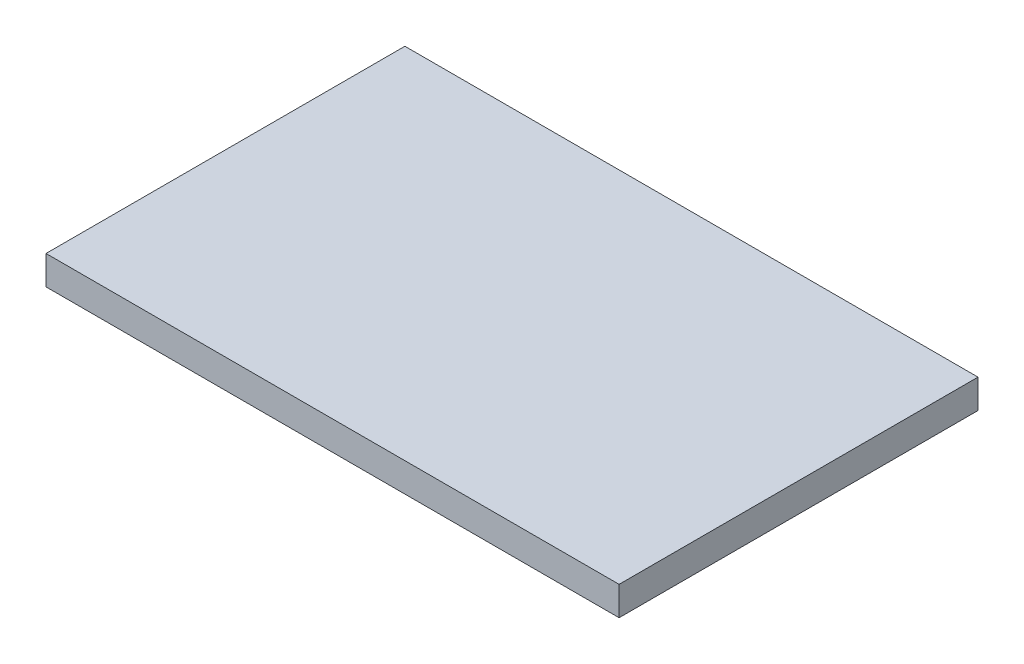
ISO-10303-21;
HEADER;
FILE_DESCRIPTION(('STEP AP214'),'2;1');
FILE_NAME('part.step','',(''),(''),'','','');
FILE_SCHEMA(('AUTOMOTIVE_DESIGN { 1 0 10303 214 1 1 1 1 }'));
ENDSEC;
DATA;
#1=APPLICATION_CONTEXT('core data for automotive mechanical design processes');
#2=APPLICATION_PROTOCOL_DEFINITION('international standard','automotive_design',2000,#1);
#3=PRODUCT_CONTEXT('',#1,'mechanical');
#4=PRODUCT('Part','Part','',(#3));
#5=PRODUCT_RELATED_PRODUCT_CATEGORY('part','',(#4));
#6=PRODUCT_DEFINITION_FORMATION('','',#4);
#7=PRODUCT_DEFINITION_CONTEXT('part definition',#1,'design');
#8=PRODUCT_DEFINITION('design','',#6,#7);
#9=PRODUCT_DEFINITION_SHAPE('','',#8);
#10=(LENGTH_UNIT() NAMED_UNIT(*) SI_UNIT(.MILLI.,.METRE.));
#11=(NAMED_UNIT(*) PLANE_ANGLE_UNIT() SI_UNIT($,.RADIAN.));
#12=(NAMED_UNIT(*) SI_UNIT($,.STERADIAN.) SOLID_ANGLE_UNIT());
#13=UNCERTAINTY_MEASURE_WITH_UNIT(LENGTH_MEASURE(1.E-05),#10,'distance_accuracy_value','');
#14=(GEOMETRIC_REPRESENTATION_CONTEXT(3) GLOBAL_UNCERTAINTY_ASSIGNED_CONTEXT((#13)) GLOBAL_UNIT_ASSIGNED_CONTEXT((#10,
#11,#12)) REPRESENTATION_CONTEXT('',''));
#15=CARTESIAN_POINT('',(0.,0.,0.));
#16=DIRECTION('',(0.,0.,1.));
#17=DIRECTION('',(1.,0.,0.));
#18=AXIS2_PLACEMENT_3D('',#15,#16,#17);
#19=CARTESIAN_POINT('',(-66.2042634425708,25.,32.0636334712058));
#20=DIRECTION('',(0.,0.,-1.));
#21=DIRECTION('',(-1.,0.,0.));
#22=AXIS2_PLACEMENT_3D('',#19,#20,#21);
#23=PLANE('',#22);
#24=DIRECTION('',(1.,0.,0.));
#25=VECTOR('',#24,1.);
#26=CARTESIAN_POINT('',(-66.2042634425708,0.,32.0636334712058));
#27=LINE('',#26,#25);
#28=CARTESIAN_POINT('',(-66.2042634425708,0.,32.0636334712058));
#29=VERTEX_POINT('',#28);
#30=CARTESIAN_POINT('',(428.795736557429,0.,32.0636334712058));
#31=VERTEX_POINT('',#30);
#32=EDGE_CURVE('E97',#29,#31,#27,.T.);
#33=ORIENTED_EDGE('',*,*,#32,.T.);
#34=DIRECTION('',(0.,-1.,0.));
#35=VECTOR('',#34,1.);
#36=CARTESIAN_POINT('',(428.795736557429,25.,32.0636334712058));
#37=LINE('',#36,#35);
#38=CARTESIAN_POINT('',(428.795736557429,25.,32.0636334712058));
#39=VERTEX_POINT('',#38);
#40=EDGE_CURVE('E11',#39,#31,#37,.T.);
#41=ORIENTED_EDGE('',*,*,#40,.F.);
#42=DIRECTION('',(1.,0.,0.));
#43=VECTOR('',#42,1.);
#44=CARTESIAN_POINT('',(-66.2042634425708,25.,32.0636334712058));
#45=LINE('',#44,#43);
#46=CARTESIAN_POINT('',(-66.2042634425708,25.,32.0636334712058));
#47=VERTEX_POINT('',#46);
#48=EDGE_CURVE('E74',#47,#39,#45,.T.);
#49=ORIENTED_EDGE('',*,*,#48,.F.);
#50=DIRECTION('',(0.,-1.,0.));
#51=VECTOR('',#50,1.);
#52=CARTESIAN_POINT('',(-66.2042634425708,25.,32.0636334712058));
#53=LINE('',#52,#51);
#54=EDGE_CURVE('E93',#47,#29,#53,.T.);
#55=ORIENTED_EDGE('',*,*,#54,.T.);
#56=EDGE_LOOP('',(#33,#41,#49,#55));
#57=FACE_BOUND('',#56,.T.);
#58=ADVANCED_FACE('F35',(#57),#23,.F.);
#59=CARTESIAN_POINT('',(428.795736557429,25.,-277.936366528794));
#60=DIRECTION('',(1.,0.,0.));
#61=DIRECTION('',(0.,0.,-1.));
#62=AXIS2_PLACEMENT_3D('',#59,#60,#61);
#63=PLANE('',#62);
#64=DIRECTION('',(0.,0.,1.));
#65=VECTOR('',#64,1.);
#66=CARTESIAN_POINT('',(428.795736557429,0.,-277.936366528794));
#67=LINE('',#66,#65);
#68=CARTESIAN_POINT('',(428.795736557429,0.,-277.936366528794));
#69=VERTEX_POINT('',#68);
#70=EDGE_CURVE('E83',#69,#31,#67,.T.);
#71=ORIENTED_EDGE('',*,*,#70,.F.);
#72=DIRECTION('',(0.,-1.,0.));
#73=VECTOR('',#72,1.);
#74=CARTESIAN_POINT('',(428.795736557429,25.,-277.936366528794));
#75=LINE('',#74,#73);
#76=CARTESIAN_POINT('',(428.795736557429,25.,-277.936366528794));
#77=VERTEX_POINT('',#76);
#78=EDGE_CURVE('E43',#77,#69,#75,.T.);
#79=ORIENTED_EDGE('',*,*,#78,.F.);
#80=DIRECTION('',(0.,0.,1.));
#81=VECTOR('',#80,1.);
#82=CARTESIAN_POINT('',(428.795736557429,25.,-277.936366528794));
#83=LINE('',#82,#81);
#84=EDGE_CURVE('E81',#77,#39,#83,.T.);
#85=ORIENTED_EDGE('',*,*,#84,.T.);
#86=ORIENTED_EDGE('',*,*,#40,.T.);
#87=EDGE_LOOP('',(#71,#79,#85,#86));
#88=FACE_BOUND('',#87,.T.);
#89=ADVANCED_FACE('F80',(#88),#63,.T.);
#90=CARTESIAN_POINT('',(-66.2042634425708,25.,-277.936366528794));
#91=DIRECTION('',(0.,0.,-1.));
#92=DIRECTION('',(-1.,0.,0.));
#93=AXIS2_PLACEMENT_3D('',#90,#91,#92);
#94=PLANE('',#93);
#95=DIRECTION('',(1.,0.,0.));
#96=VECTOR('',#95,1.);
#97=CARTESIAN_POINT('',(-66.2042634425708,0.,-277.936366528794));
#98=LINE('',#97,#96);
#99=CARTESIAN_POINT('',(-66.2042634425708,0.,-277.936366528794));
#100=VERTEX_POINT('',#99);
#101=EDGE_CURVE('E101',#100,#69,#98,.T.);
#102=ORIENTED_EDGE('',*,*,#101,.F.);
#103=DIRECTION('',(0.,-1.,0.));
#104=VECTOR('',#103,1.);
#105=CARTESIAN_POINT('',(-66.2042634425708,25.,-277.936366528794));
#106=LINE('',#105,#104);
#107=CARTESIAN_POINT('',(-66.2042634425708,25.,-277.936366528794));
#108=VERTEX_POINT('',#107);
#109=EDGE_CURVE('E66',#108,#100,#106,.T.);
#110=ORIENTED_EDGE('',*,*,#109,.F.);
#111=DIRECTION('',(1.,0.,0.));
#112=VECTOR('',#111,1.);
#113=CARTESIAN_POINT('',(-66.2042634425708,25.,-277.936366528794));
#114=LINE('',#113,#112);
#115=EDGE_CURVE('E89',#108,#77,#114,.T.);
#116=ORIENTED_EDGE('',*,*,#115,.T.);
#117=ORIENTED_EDGE('',*,*,#78,.T.);
#118=EDGE_LOOP('',(#102,#110,#116,#117));
#119=FACE_BOUND('',#118,.T.);
#120=ADVANCED_FACE('F91',(#119),#94,.T.);
#121=CARTESIAN_POINT('',(-66.2042634425708,25.,-277.936366528794));
#122=DIRECTION('',(1.,0.,0.));
#123=DIRECTION('',(0.,0.,-1.));
#124=AXIS2_PLACEMENT_3D('',#121,#122,#123);
#125=PLANE('',#124);
#126=DIRECTION('',(0.,0.,1.));
#127=VECTOR('',#126,1.);
#128=CARTESIAN_POINT('',(-66.2042634425708,0.,-277.936366528794));
#129=LINE('',#128,#127);
#130=EDGE_CURVE('E69',#100,#29,#129,.T.);
#131=ORIENTED_EDGE('',*,*,#130,.T.);
#132=ORIENTED_EDGE('',*,*,#54,.F.);
#133=DIRECTION('',(0.,0.,1.));
#134=VECTOR('',#133,1.);
#135=CARTESIAN_POINT('',(-66.2042634425708,25.,-277.936366528794));
#136=LINE('',#135,#134);
#137=EDGE_CURVE('E51',#108,#47,#136,.T.);
#138=ORIENTED_EDGE('',*,*,#137,.F.);
#139=ORIENTED_EDGE('',*,*,#109,.T.);
#140=EDGE_LOOP('',(#131,#132,#138,#139));
#141=FACE_BOUND('',#140,.T.);
#142=ADVANCED_FACE('F114',(#141),#125,.F.);
#143=CARTESIAN_POINT('',(0.,25.,0.));
#144=DIRECTION('',(0.,-1.,0.));
#145=DIRECTION('',(0.,0.,-1.));
#146=AXIS2_PLACEMENT_3D('',#143,#144,#145);
#147=PLANE('',#146);
#148=ORIENTED_EDGE('',*,*,#48,.T.);
#149=ORIENTED_EDGE('',*,*,#84,.F.);
#150=ORIENTED_EDGE('',*,*,#115,.F.);
#151=ORIENTED_EDGE('',*,*,#137,.T.);
#152=EDGE_LOOP('',(#148,#149,#150,#151));
#153=FACE_BOUND('',#152,.T.);
#154=ADVANCED_FACE('F88',(#153),#147,.F.);
#155=CARTESIAN_POINT('',(0.,0.,0.));
#156=DIRECTION('',(0.,-1.,0.));
#157=DIRECTION('',(0.,0.,-1.));
#158=AXIS2_PLACEMENT_3D('',#155,#156,#157);
#159=PLANE('',#158);
#160=ORIENTED_EDGE('',*,*,#32,.F.);
#161=ORIENTED_EDGE('',*,*,#130,.F.);
#162=ORIENTED_EDGE('',*,*,#101,.T.);
#163=ORIENTED_EDGE('',*,*,#70,.T.);
#164=EDGE_LOOP('',(#160,#161,#162,#163));
#165=FACE_BOUND('',#164,.T.);
#166=ADVANCED_FACE('F108',(#165),#159,.T.);
#167=CLOSED_SHELL('',(#58,#89,#120,#142,#154,#166));
#168=MANIFOLD_SOLID_BREP('B2',#167);
#169=ADVANCED_BREP_SHAPE_REPRESENTATION('',(#18,#168),#14);
#170=SHAPE_DEFINITION_REPRESENTATION(#9,#169);
ENDSEC;
END-ISO-10303-21;
